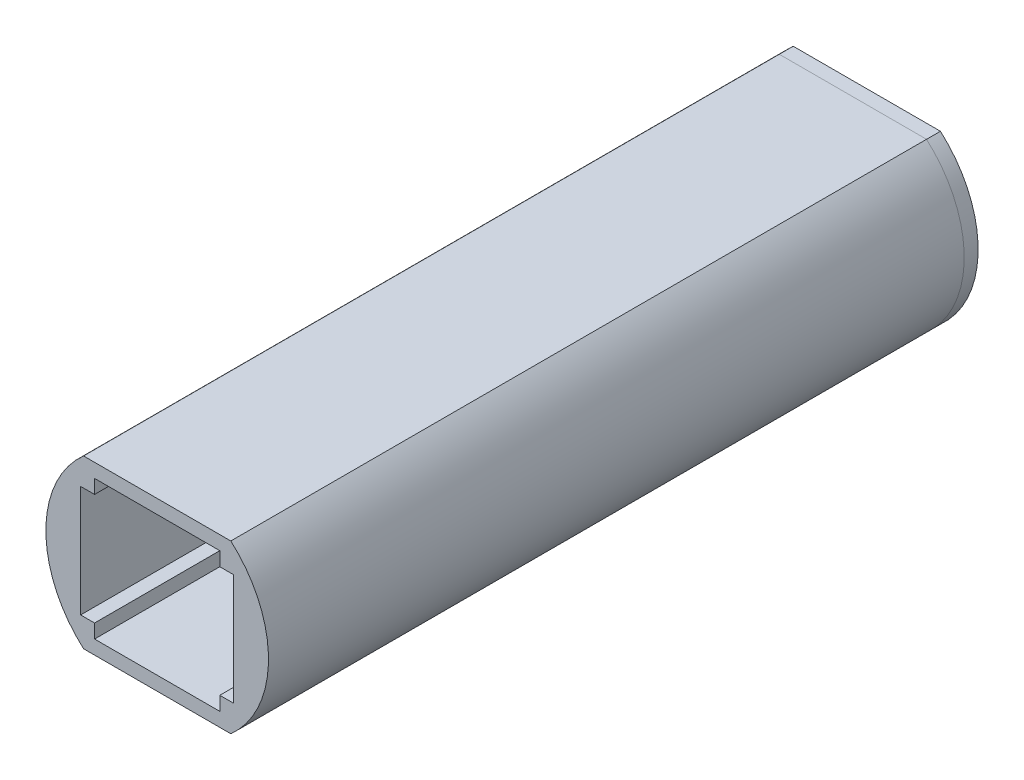
ISO-10303-21;
HEADER;
FILE_DESCRIPTION(('STEP AP214'),'2;1');
FILE_NAME('part.step','',(''),(''),'','','');
FILE_SCHEMA(('AUTOMOTIVE_DESIGN { 1 0 10303 214 1 1 1 1 }'));
ENDSEC;
DATA;
#1=APPLICATION_CONTEXT('core data for automotive mechanical design processes');
#2=APPLICATION_PROTOCOL_DEFINITION('international standard','automotive_design',2000,#1);
#3=PRODUCT_CONTEXT('',#1,'mechanical');
#4=PRODUCT('Part','Part','',(#3));
#5=PRODUCT_RELATED_PRODUCT_CATEGORY('part','',(#4));
#6=PRODUCT_DEFINITION_FORMATION('','',#4);
#7=PRODUCT_DEFINITION_CONTEXT('part definition',#1,'design');
#8=PRODUCT_DEFINITION('design','',#6,#7);
#9=PRODUCT_DEFINITION_SHAPE('','',#8);
#10=(LENGTH_UNIT() NAMED_UNIT(*) SI_UNIT(.MILLI.,.METRE.));
#11=(NAMED_UNIT(*) PLANE_ANGLE_UNIT() SI_UNIT($,.RADIAN.));
#12=(NAMED_UNIT(*) SI_UNIT($,.STERADIAN.) SOLID_ANGLE_UNIT());
#13=UNCERTAINTY_MEASURE_WITH_UNIT(LENGTH_MEASURE(1.E-05),#10,'distance_accuracy_value','');
#14=(GEOMETRIC_REPRESENTATION_CONTEXT(3) GLOBAL_UNCERTAINTY_ASSIGNED_CONTEXT((#13)) GLOBAL_UNIT_ASSIGNED_CONTEXT((#10,
#11,#12)) REPRESENTATION_CONTEXT('',''));
#15=CARTESIAN_POINT('',(0.,0.,0.));
#16=DIRECTION('',(0.,0.,1.));
#17=DIRECTION('',(1.,0.,0.));
#18=AXIS2_PLACEMENT_3D('',#15,#16,#17);
#19=CARTESIAN_POINT('',(0.,0.,51.));
#20=DIRECTION('',(0.,0.,-1.));
#21=DIRECTION('',(-1.,0.,0.));
#22=AXIS2_PLACEMENT_3D('',#19,#20,#21);
#23=CYLINDRICAL_SURFACE('',#22,8.);
#24=CARTESIAN_POINT('',(0.,0.,1.));
#25=DIRECTION('',(0.,0.,1.));
#26=DIRECTION('',(1.,0.,0.));
#27=AXIS2_PLACEMENT_3D('',#24,#25,#26);
#28=CIRCLE('',#27,8.);
#29=CARTESIAN_POINT('',(-5.29150262212918,6.,1.));
#30=VERTEX_POINT('',#29);
#31=CARTESIAN_POINT('',(-5.29150262212918,-6.,1.));
#32=VERTEX_POINT('',#31);
#33=EDGE_CURVE('E179',#30,#32,#28,.T.);
#34=ORIENTED_EDGE('',*,*,#33,.T.);
#35=DIRECTION('',(0.,0.,-1.));
#36=VECTOR('',#35,1.);
#37=CARTESIAN_POINT('',(-5.29150262212918,-6.,51.));
#38=LINE('',#37,#36);
#39=CARTESIAN_POINT('',(-5.29150262212918,-6.,51.));
#40=VERTEX_POINT('',#39);
#41=EDGE_CURVE('E12',#40,#32,#38,.T.);
#42=ORIENTED_EDGE('',*,*,#41,.F.);
#43=CARTESIAN_POINT('',(0.,0.,51.));
#44=DIRECTION('',(0.,0.,1.));
#45=DIRECTION('',(1.,0.,0.));
#46=AXIS2_PLACEMENT_3D('',#43,#44,#45);
#47=CIRCLE('',#46,8.);
#48=CARTESIAN_POINT('',(-5.29150262212918,6.,51.));
#49=VERTEX_POINT('',#48);
#50=EDGE_CURVE('E244',#49,#40,#47,.T.);
#51=ORIENTED_EDGE('',*,*,#50,.F.);
#52=DIRECTION('',(0.,0.,-1.));
#53=VECTOR('',#52,1.);
#54=CARTESIAN_POINT('',(-5.29150262212918,6.,51.));
#55=LINE('',#54,#53);
#56=EDGE_CURVE('E254',#49,#30,#55,.T.);
#57=ORIENTED_EDGE('',*,*,#56,.T.);
#58=EDGE_LOOP('',(#34,#42,#51,#57));
#59=FACE_BOUND('',#58,.T.);
#60=ADVANCED_FACE('F53',(#59),#23,.T.);
#61=CARTESIAN_POINT('',(-5.29150262212918,-6.,51.));
#62=DIRECTION('',(0.,1.,0.));
#63=DIRECTION('',(0.,0.,1.));
#64=AXIS2_PLACEMENT_3D('',#61,#62,#63);
#65=PLANE('',#64);
#66=DIRECTION('',(1.,0.,0.));
#67=VECTOR('',#66,1.);
#68=CARTESIAN_POINT('',(-5.29150262212918,-6.,1.));
#69=LINE('',#68,#67);
#70=CARTESIAN_POINT('',(5.29150262212918,-6.,1.));
#71=VERTEX_POINT('',#70);
#72=EDGE_CURVE('E257',#32,#71,#69,.T.);
#73=ORIENTED_EDGE('',*,*,#72,.T.);
#74=DIRECTION('',(0.,0.,-1.));
#75=VECTOR('',#74,1.);
#76=CARTESIAN_POINT('',(5.29150262212918,-6.,51.));
#77=LINE('',#76,#75);
#78=CARTESIAN_POINT('',(5.29150262212918,-6.,51.));
#79=VERTEX_POINT('',#78);
#80=EDGE_CURVE('E60',#79,#71,#77,.T.);
#81=ORIENTED_EDGE('',*,*,#80,.F.);
#82=DIRECTION('',(1.,0.,0.));
#83=VECTOR('',#82,1.);
#84=CARTESIAN_POINT('',(-5.29150262212918,-6.,51.));
#85=LINE('',#84,#83);
#86=EDGE_CURVE('E247',#40,#79,#85,.T.);
#87=ORIENTED_EDGE('',*,*,#86,.F.);
#88=ORIENTED_EDGE('',*,*,#41,.T.);
#89=EDGE_LOOP('',(#73,#81,#87,#88));
#90=FACE_BOUND('',#89,.T.);
#91=ADVANCED_FACE('F285',(#90),#65,.F.);
#92=CARTESIAN_POINT('',(0.,0.,51.));
#93=DIRECTION('',(0.,0.,-1.));
#94=DIRECTION('',(-1.,0.,0.));
#95=AXIS2_PLACEMENT_3D('',#92,#93,#94);
#96=CYLINDRICAL_SURFACE('',#95,8.);
#97=CARTESIAN_POINT('',(0.,0.,1.));
#98=DIRECTION('',(0.,0.,1.));
#99=DIRECTION('',(1.,0.,0.));
#100=AXIS2_PLACEMENT_3D('',#97,#98,#99);
#101=CIRCLE('',#100,8.);
#102=CARTESIAN_POINT('',(5.29150262212918,6.,1.));
#103=VERTEX_POINT('',#102);
#104=EDGE_CURVE('E259',#71,#103,#101,.T.);
#105=ORIENTED_EDGE('',*,*,#104,.T.);
#106=DIRECTION('',(0.,0.,-1.));
#107=VECTOR('',#106,1.);
#108=CARTESIAN_POINT('',(5.29150262212918,6.,51.));
#109=LINE('',#108,#107);
#110=CARTESIAN_POINT('',(5.29150262212918,6.,51.));
#111=VERTEX_POINT('',#110);
#112=EDGE_CURVE('E264',#111,#103,#109,.T.);
#113=ORIENTED_EDGE('',*,*,#112,.F.);
#114=CARTESIAN_POINT('',(0.,0.,51.));
#115=DIRECTION('',(0.,0.,1.));
#116=DIRECTION('',(1.,0.,0.));
#117=AXIS2_PLACEMENT_3D('',#114,#115,#116);
#118=CIRCLE('',#117,8.);
#119=EDGE_CURVE('E250',#79,#111,#118,.T.);
#120=ORIENTED_EDGE('',*,*,#119,.F.);
#121=ORIENTED_EDGE('',*,*,#80,.T.);
#122=EDGE_LOOP('',(#105,#113,#120,#121));
#123=FACE_BOUND('',#122,.T.);
#124=ADVANCED_FACE('F271',(#123),#96,.T.);
#125=CARTESIAN_POINT('',(-5.29150262212918,6.,51.));
#126=DIRECTION('',(0.,-1.,0.));
#127=DIRECTION('',(0.,0.,-1.));
#128=AXIS2_PLACEMENT_3D('',#125,#126,#127);
#129=PLANE('',#128);
#130=DIRECTION('',(-1.,0.,0.));
#131=VECTOR('',#130,1.);
#132=CARTESIAN_POINT('',(-5.29150262212918,6.,1.));
#133=LINE('',#132,#131);
#134=EDGE_CURVE('E248',#103,#30,#133,.T.);
#135=ORIENTED_EDGE('',*,*,#134,.T.);
#136=ORIENTED_EDGE('',*,*,#56,.F.);
#137=DIRECTION('',(-1.,0.,0.));
#138=VECTOR('',#137,1.);
#139=CARTESIAN_POINT('',(-5.29150262212918,6.,51.));
#140=LINE('',#139,#138);
#141=EDGE_CURVE('E252',#111,#49,#140,.T.);
#142=ORIENTED_EDGE('',*,*,#141,.F.);
#143=ORIENTED_EDGE('',*,*,#112,.T.);
#144=EDGE_LOOP('',(#135,#136,#142,#143));
#145=FACE_BOUND('',#144,.T.);
#146=ADVANCED_FACE('F278',(#145),#129,.F.);
#147=CARTESIAN_POINT('',(0.,0.,51.));
#148=DIRECTION('',(0.,0.,1.));
#149=DIRECTION('',(1.,0.,0.));
#150=AXIS2_PLACEMENT_3D('',#147,#148,#149);
#151=PLANE('',#150);
#152=DIRECTION('',(-1.,0.,0.));
#153=VECTOR('',#152,1.);
#154=CARTESIAN_POINT('',(4.5,5.,51.));
#155=LINE('',#154,#153);
#156=CARTESIAN_POINT('',(4.5,5.,51.));
#157=VERTEX_POINT('',#156);
#158=CARTESIAN_POINT('',(-4.5,5.,51.));
#159=VERTEX_POINT('',#158);
#160=EDGE_CURVE('E67',#157,#159,#155,.T.);
#161=ORIENTED_EDGE('',*,*,#160,.F.);
#162=DIRECTION('',(0.,1.,0.));
#163=VECTOR('',#162,1.);
#164=CARTESIAN_POINT('',(4.5,5.,51.));
#165=LINE('',#164,#163);
#166=CARTESIAN_POINT('',(4.5,4.,51.));
#167=VERTEX_POINT('',#166);
#168=EDGE_CURVE('E173',#167,#157,#165,.T.);
#169=ORIENTED_EDGE('',*,*,#168,.F.);
#170=DIRECTION('',(-1.,0.,0.));
#171=VECTOR('',#170,1.);
#172=CARTESIAN_POINT('',(4.5,4.,51.));
#173=LINE('',#172,#171);
#174=CARTESIAN_POINT('',(5.5,4.,51.));
#175=VERTEX_POINT('',#174);
#176=EDGE_CURVE('E219',#175,#167,#173,.T.);
#177=ORIENTED_EDGE('',*,*,#176,.F.);
#178=DIRECTION('',(0.,1.,0.));
#179=VECTOR('',#178,1.);
#180=CARTESIAN_POINT('',(5.5,-4.,51.));
#181=LINE('',#180,#179);
#182=CARTESIAN_POINT('',(5.5,-4.,51.));
#183=VERTEX_POINT('',#182);
#184=EDGE_CURVE('E216',#183,#175,#181,.T.);
#185=ORIENTED_EDGE('',*,*,#184,.F.);
#186=DIRECTION('',(1.,0.,0.));
#187=VECTOR('',#186,1.);
#188=CARTESIAN_POINT('',(4.5,-4.,51.));
#189=LINE('',#188,#187);
#190=CARTESIAN_POINT('',(4.5,-4.,51.));
#191=VERTEX_POINT('',#190);
#192=EDGE_CURVE('E213',#191,#183,#189,.T.);
#193=ORIENTED_EDGE('',*,*,#192,.F.);
#194=DIRECTION('',(0.,1.,0.));
#195=VECTOR('',#194,1.);
#196=CARTESIAN_POINT('',(4.5,-5.,51.));
#197=LINE('',#196,#195);
#198=CARTESIAN_POINT('',(4.5,-5.,51.));
#199=VERTEX_POINT('',#198);
#200=EDGE_CURVE('E210',#199,#191,#197,.T.);
#201=ORIENTED_EDGE('',*,*,#200,.F.);
#202=DIRECTION('',(1.,0.,0.));
#203=VECTOR('',#202,1.);
#204=CARTESIAN_POINT('',(4.5,-5.,51.));
#205=LINE('',#204,#203);
#206=CARTESIAN_POINT('',(-4.5,-5.,51.));
#207=VERTEX_POINT('',#206);
#208=EDGE_CURVE('E207',#207,#199,#205,.T.);
#209=ORIENTED_EDGE('',*,*,#208,.F.);
#210=DIRECTION('',(0.,-1.,0.));
#211=VECTOR('',#210,1.);
#212=CARTESIAN_POINT('',(-4.5,-5.,51.));
#213=LINE('',#212,#211);
#214=CARTESIAN_POINT('',(-4.5,-4.,51.));
#215=VERTEX_POINT('',#214);
#216=EDGE_CURVE('E204',#215,#207,#213,.T.);
#217=ORIENTED_EDGE('',*,*,#216,.F.);
#218=DIRECTION('',(1.,0.,0.));
#219=VECTOR('',#218,1.);
#220=CARTESIAN_POINT('',(-4.5,-4.,51.));
#221=LINE('',#220,#219);
#222=CARTESIAN_POINT('',(-5.5,-4.,51.));
#223=VERTEX_POINT('',#222);
#224=EDGE_CURVE('E201',#223,#215,#221,.T.);
#225=ORIENTED_EDGE('',*,*,#224,.F.);
#226=DIRECTION('',(0.,-1.,0.));
#227=VECTOR('',#226,1.);
#228=CARTESIAN_POINT('',(-5.5,-4.,51.));
#229=LINE('',#228,#227);
#230=CARTESIAN_POINT('',(-5.5,4.,51.));
#231=VERTEX_POINT('',#230);
#232=EDGE_CURVE('E198',#231,#223,#229,.T.);
#233=ORIENTED_EDGE('',*,*,#232,.F.);
#234=DIRECTION('',(-1.,0.,0.));
#235=VECTOR('',#234,1.);
#236=CARTESIAN_POINT('',(-4.5,4.,51.));
#237=LINE('',#236,#235);
#238=CARTESIAN_POINT('',(-4.5,4.,51.));
#239=VERTEX_POINT('',#238);
#240=EDGE_CURVE('E195',#239,#231,#237,.T.);
#241=ORIENTED_EDGE('',*,*,#240,.F.);
#242=DIRECTION('',(0.,-1.,0.));
#243=VECTOR('',#242,1.);
#244=CARTESIAN_POINT('',(-4.5,5.,51.));
#245=LINE('',#244,#243);
#246=EDGE_CURVE('E188',#159,#239,#245,.T.);
#247=ORIENTED_EDGE('',*,*,#246,.F.);
#248=EDGE_LOOP('',(#161,#169,#177,#185,#193,#201,#209,#217,#225,#233,#241,#247));
#249=FACE_BOUND('',#248,.T.);
#250=ORIENTED_EDGE('',*,*,#50,.T.);
#251=ORIENTED_EDGE('',*,*,#86,.T.);
#252=ORIENTED_EDGE('',*,*,#119,.T.);
#253=ORIENTED_EDGE('',*,*,#141,.T.);
#254=EDGE_LOOP('',(#250,#251,#252,#253));
#255=FACE_BOUND('',#254,.T.);
#256=ADVANCED_FACE('F284',(#249,#255),#151,.T.);
#257=CARTESIAN_POINT('',(0.,0.,1.));
#258=DIRECTION('',(0.,0.,1.));
#259=DIRECTION('',(1.,0.,0.));
#260=AXIS2_PLACEMENT_3D('',#257,#258,#259);
#261=PLANE('',#260);
#262=DIRECTION('',(0.,-1.,0.));
#263=VECTOR('',#262,1.);
#264=CARTESIAN_POINT('',(4.5,5.,1.));
#265=LINE('',#264,#263);
#266=CARTESIAN_POINT('',(4.5,5.,1.));
#267=VERTEX_POINT('',#266);
#268=CARTESIAN_POINT('',(4.5,4.,1.));
#269=VERTEX_POINT('',#268);
#270=EDGE_CURVE('E186',#267,#269,#265,.T.);
#271=ORIENTED_EDGE('',*,*,#270,.F.);
#272=DIRECTION('',(1.,0.,0.));
#273=VECTOR('',#272,1.);
#274=CARTESIAN_POINT('',(4.5,5.,1.));
#275=LINE('',#274,#273);
#276=CARTESIAN_POINT('',(-4.5,5.,1.));
#277=VERTEX_POINT('',#276);
#278=EDGE_CURVE('E167',#277,#267,#275,.T.);
#279=ORIENTED_EDGE('',*,*,#278,.F.);
#280=DIRECTION('',(0.,1.,0.));
#281=VECTOR('',#280,1.);
#282=CARTESIAN_POINT('',(-4.5,5.,1.));
#283=LINE('',#282,#281);
#284=CARTESIAN_POINT('',(-4.5,4.,1.));
#285=VERTEX_POINT('',#284);
#286=EDGE_CURVE('E176',#285,#277,#283,.T.);
#287=ORIENTED_EDGE('',*,*,#286,.F.);
#288=DIRECTION('',(1.,0.,0.));
#289=VECTOR('',#288,1.);
#290=CARTESIAN_POINT('',(-4.5,4.,1.));
#291=LINE('',#290,#289);
#292=CARTESIAN_POINT('',(-5.5,4.,1.));
#293=VERTEX_POINT('',#292);
#294=EDGE_CURVE('E75',#293,#285,#291,.T.);
#295=ORIENTED_EDGE('',*,*,#294,.F.);
#296=DIRECTION('',(0.,1.,0.));
#297=VECTOR('',#296,1.);
#298=CARTESIAN_POINT('',(-5.5,-4.,1.));
#299=LINE('',#298,#297);
#300=CARTESIAN_POINT('',(-5.5,-4.,1.));
#301=VERTEX_POINT('',#300);
#302=EDGE_CURVE('E366',#301,#293,#299,.T.);
#303=ORIENTED_EDGE('',*,*,#302,.F.);
#304=DIRECTION('',(-1.,0.,0.));
#305=VECTOR('',#304,1.);
#306=CARTESIAN_POINT('',(-4.5,-4.,1.));
#307=LINE('',#306,#305);
#308=CARTESIAN_POINT('',(-4.5,-4.,1.));
#309=VERTEX_POINT('',#308);
#310=EDGE_CURVE('E363',#309,#301,#307,.T.);
#311=ORIENTED_EDGE('',*,*,#310,.F.);
#312=DIRECTION('',(0.,1.,0.));
#313=VECTOR('',#312,1.);
#314=CARTESIAN_POINT('',(-4.5,-5.,1.));
#315=LINE('',#314,#313);
#316=CARTESIAN_POINT('',(-4.5,-5.,1.));
#317=VERTEX_POINT('',#316);
#318=EDGE_CURVE('E360',#317,#309,#315,.T.);
#319=ORIENTED_EDGE('',*,*,#318,.F.);
#320=DIRECTION('',(-1.,0.,0.));
#321=VECTOR('',#320,1.);
#322=CARTESIAN_POINT('',(4.5,-5.,1.));
#323=LINE('',#322,#321);
#324=CARTESIAN_POINT('',(4.5,-5.,1.));
#325=VERTEX_POINT('',#324);
#326=EDGE_CURVE('E357',#325,#317,#323,.T.);
#327=ORIENTED_EDGE('',*,*,#326,.F.);
#328=DIRECTION('',(0.,-1.,0.));
#329=VECTOR('',#328,1.);
#330=CARTESIAN_POINT('',(4.5,-5.,1.));
#331=LINE('',#330,#329);
#332=CARTESIAN_POINT('',(4.5,-4.,1.));
#333=VERTEX_POINT('',#332);
#334=EDGE_CURVE('E354',#333,#325,#331,.T.);
#335=ORIENTED_EDGE('',*,*,#334,.F.);
#336=DIRECTION('',(-1.,0.,0.));
#337=VECTOR('',#336,1.);
#338=CARTESIAN_POINT('',(4.5,-4.,1.));
#339=LINE('',#338,#337);
#340=CARTESIAN_POINT('',(5.5,-4.,1.));
#341=VERTEX_POINT('',#340);
#342=EDGE_CURVE('E349',#341,#333,#339,.T.);
#343=ORIENTED_EDGE('',*,*,#342,.F.);
#344=DIRECTION('',(0.,-1.,0.));
#345=VECTOR('',#344,1.);
#346=CARTESIAN_POINT('',(5.5,-4.,1.));
#347=LINE('',#346,#345);
#348=CARTESIAN_POINT('',(5.5,4.,1.));
#349=VERTEX_POINT('',#348);
#350=EDGE_CURVE('E348',#349,#341,#347,.T.);
#351=ORIENTED_EDGE('',*,*,#350,.F.);
#352=DIRECTION('',(1.,0.,0.));
#353=VECTOR('',#352,1.);
#354=CARTESIAN_POINT('',(4.5,4.,1.));
#355=LINE('',#354,#353);
#356=EDGE_CURVE('E190',#269,#349,#355,.T.);
#357=ORIENTED_EDGE('',*,*,#356,.F.);
#358=EDGE_LOOP('',(#271,#279,#287,#295,#303,#311,#319,#327,#335,#343,#351,#357));
#359=FACE_BOUND('',#358,.T.);
#360=ORIENTED_EDGE('',*,*,#33,.F.);
#361=ORIENTED_EDGE('',*,*,#134,.F.);
#362=ORIENTED_EDGE('',*,*,#104,.F.);
#363=ORIENTED_EDGE('',*,*,#72,.F.);
#364=EDGE_LOOP('',(#360,#361,#362,#363));
#365=FACE_BOUND('',#364,.T.);
#366=ADVANCED_FACE('F182',(#359,#365),#261,.F.);
#367=CARTESIAN_POINT('',(4.5,5.,-0.001000000000001));
#368=DIRECTION('',(0.,1.,0.));
#369=DIRECTION('',(0.,0.,1.));
#370=AXIS2_PLACEMENT_3D('',#367,#368,#369);
#371=PLANE('',#370);
#372=ORIENTED_EDGE('',*,*,#278,.T.);
#373=DIRECTION('',(0.,0.,1.));
#374=VECTOR('',#373,1.);
#375=CARTESIAN_POINT('',(4.5,5.,-0.001000000000001));
#376=LINE('',#375,#374);
#377=EDGE_CURVE('E180',#267,#157,#376,.T.);
#378=ORIENTED_EDGE('',*,*,#377,.T.);
#379=ORIENTED_EDGE('',*,*,#160,.T.);
#380=DIRECTION('',(0.,0.,1.));
#381=VECTOR('',#380,1.);
#382=CARTESIAN_POINT('',(-4.5,5.,-0.001000000000001));
#383=LINE('',#382,#381);
#384=EDGE_CURVE('E163',#277,#159,#383,.T.);
#385=ORIENTED_EDGE('',*,*,#384,.F.);
#386=EDGE_LOOP('',(#372,#378,#379,#385));
#387=FACE_BOUND('',#386,.T.);
#388=ADVANCED_FACE('F165',(#387),#371,.F.);
#389=CARTESIAN_POINT('',(4.5,5.,-0.001000000000001));
#390=DIRECTION('',(1.,0.,0.));
#391=DIRECTION('',(0.,0.,-1.));
#392=AXIS2_PLACEMENT_3D('',#389,#390,#391);
#393=PLANE('',#392);
#394=ORIENTED_EDGE('',*,*,#270,.T.);
#395=DIRECTION('',(0.,0.,1.));
#396=VECTOR('',#395,1.);
#397=CARTESIAN_POINT('',(4.5,4.,-0.001000000000001));
#398=LINE('',#397,#396);
#399=EDGE_CURVE('E225',#269,#167,#398,.T.);
#400=ORIENTED_EDGE('',*,*,#399,.T.);
#401=ORIENTED_EDGE('',*,*,#168,.T.);
#402=ORIENTED_EDGE('',*,*,#377,.F.);
#403=EDGE_LOOP('',(#394,#400,#401,#402));
#404=FACE_BOUND('',#403,.T.);
#405=ADVANCED_FACE('F302',(#404),#393,.F.);
#406=CARTESIAN_POINT('',(4.5,4.,-0.001000000000001));
#407=DIRECTION('',(0.,1.,0.));
#408=DIRECTION('',(0.,0.,1.));
#409=AXIS2_PLACEMENT_3D('',#406,#407,#408);
#410=PLANE('',#409);
#411=ORIENTED_EDGE('',*,*,#356,.T.);
#412=DIRECTION('',(0.,0.,1.));
#413=VECTOR('',#412,1.);
#414=CARTESIAN_POINT('',(5.5,4.,-0.001000000000001));
#415=LINE('',#414,#413);
#416=EDGE_CURVE('E227',#349,#175,#415,.T.);
#417=ORIENTED_EDGE('',*,*,#416,.T.);
#418=ORIENTED_EDGE('',*,*,#176,.T.);
#419=ORIENTED_EDGE('',*,*,#399,.F.);
#420=EDGE_LOOP('',(#411,#417,#418,#419));
#421=FACE_BOUND('',#420,.T.);
#422=ADVANCED_FACE('F335',(#421),#410,.F.);
#423=CARTESIAN_POINT('',(5.5,-4.,-0.001000000000001));
#424=DIRECTION('',(1.,0.,0.));
#425=DIRECTION('',(0.,0.,-1.));
#426=AXIS2_PLACEMENT_3D('',#423,#424,#425);
#427=PLANE('',#426);
#428=ORIENTED_EDGE('',*,*,#350,.T.);
#429=DIRECTION('',(0.,0.,1.));
#430=VECTOR('',#429,1.);
#431=CARTESIAN_POINT('',(5.5,-4.,-0.001000000000001));
#432=LINE('',#431,#430);
#433=EDGE_CURVE('E229',#341,#183,#432,.T.);
#434=ORIENTED_EDGE('',*,*,#433,.T.);
#435=ORIENTED_EDGE('',*,*,#184,.T.);
#436=ORIENTED_EDGE('',*,*,#416,.F.);
#437=EDGE_LOOP('',(#428,#434,#435,#436));
#438=FACE_BOUND('',#437,.T.);
#439=ADVANCED_FACE('F331',(#438),#427,.F.);
#440=CARTESIAN_POINT('',(4.5,-4.,-0.001000000000001));
#441=DIRECTION('',(0.,-1.,0.));
#442=DIRECTION('',(0.,0.,-1.));
#443=AXIS2_PLACEMENT_3D('',#440,#441,#442);
#444=PLANE('',#443);
#445=ORIENTED_EDGE('',*,*,#342,.T.);
#446=DIRECTION('',(0.,0.,1.));
#447=VECTOR('',#446,1.);
#448=CARTESIAN_POINT('',(4.5,-4.,-0.001000000000001));
#449=LINE('',#448,#447);
#450=EDGE_CURVE('E231',#333,#191,#449,.T.);
#451=ORIENTED_EDGE('',*,*,#450,.T.);
#452=ORIENTED_EDGE('',*,*,#192,.T.);
#453=ORIENTED_EDGE('',*,*,#433,.F.);
#454=EDGE_LOOP('',(#445,#451,#452,#453));
#455=FACE_BOUND('',#454,.T.);
#456=ADVANCED_FACE('F327',(#455),#444,.F.);
#457=CARTESIAN_POINT('',(4.5,-5.,-0.001000000000001));
#458=DIRECTION('',(1.,0.,0.));
#459=DIRECTION('',(0.,0.,-1.));
#460=AXIS2_PLACEMENT_3D('',#457,#458,#459);
#461=PLANE('',#460);
#462=ORIENTED_EDGE('',*,*,#334,.T.);
#463=DIRECTION('',(0.,0.,1.));
#464=VECTOR('',#463,1.);
#465=CARTESIAN_POINT('',(4.5,-5.,-0.001000000000001));
#466=LINE('',#465,#464);
#467=EDGE_CURVE('E233',#325,#199,#466,.T.);
#468=ORIENTED_EDGE('',*,*,#467,.T.);
#469=ORIENTED_EDGE('',*,*,#200,.T.);
#470=ORIENTED_EDGE('',*,*,#450,.F.);
#471=EDGE_LOOP('',(#462,#468,#469,#470));
#472=FACE_BOUND('',#471,.T.);
#473=ADVANCED_FACE('F323',(#472),#461,.F.);
#474=CARTESIAN_POINT('',(4.5,-5.,-0.001000000000001));
#475=DIRECTION('',(0.,-1.,0.));
#476=DIRECTION('',(0.,0.,-1.));
#477=AXIS2_PLACEMENT_3D('',#474,#475,#476);
#478=PLANE('',#477);
#479=ORIENTED_EDGE('',*,*,#326,.T.);
#480=DIRECTION('',(0.,0.,1.));
#481=VECTOR('',#480,1.);
#482=CARTESIAN_POINT('',(-4.5,-5.,-0.001000000000001));
#483=LINE('',#482,#481);
#484=EDGE_CURVE('E235',#317,#207,#483,.T.);
#485=ORIENTED_EDGE('',*,*,#484,.T.);
#486=ORIENTED_EDGE('',*,*,#208,.T.);
#487=ORIENTED_EDGE('',*,*,#467,.F.);
#488=EDGE_LOOP('',(#479,#485,#486,#487));
#489=FACE_BOUND('',#488,.T.);
#490=ADVANCED_FACE('F319',(#489),#478,.F.);
#491=CARTESIAN_POINT('',(-4.5,-5.,-0.001000000000001));
#492=DIRECTION('',(-1.,0.,0.));
#493=DIRECTION('',(0.,0.,1.));
#494=AXIS2_PLACEMENT_3D('',#491,#492,#493);
#495=PLANE('',#494);
#496=ORIENTED_EDGE('',*,*,#318,.T.);
#497=DIRECTION('',(0.,0.,1.));
#498=VECTOR('',#497,1.);
#499=CARTESIAN_POINT('',(-4.5,-4.,-0.001000000000001));
#500=LINE('',#499,#498);
#501=EDGE_CURVE('E237',#309,#215,#500,.T.);
#502=ORIENTED_EDGE('',*,*,#501,.T.);
#503=ORIENTED_EDGE('',*,*,#216,.T.);
#504=ORIENTED_EDGE('',*,*,#484,.F.);
#505=EDGE_LOOP('',(#496,#502,#503,#504));
#506=FACE_BOUND('',#505,.T.);
#507=ADVANCED_FACE('F315',(#506),#495,.F.);
#508=CARTESIAN_POINT('',(-4.5,-4.,-0.001000000000001));
#509=DIRECTION('',(0.,-1.,0.));
#510=DIRECTION('',(0.,0.,-1.));
#511=AXIS2_PLACEMENT_3D('',#508,#509,#510);
#512=PLANE('',#511);
#513=ORIENTED_EDGE('',*,*,#310,.T.);
#514=DIRECTION('',(0.,0.,1.));
#515=VECTOR('',#514,1.);
#516=CARTESIAN_POINT('',(-5.5,-4.,-0.001000000000001));
#517=LINE('',#516,#515);
#518=EDGE_CURVE('E239',#301,#223,#517,.T.);
#519=ORIENTED_EDGE('',*,*,#518,.T.);
#520=ORIENTED_EDGE('',*,*,#224,.T.);
#521=ORIENTED_EDGE('',*,*,#501,.F.);
#522=EDGE_LOOP('',(#513,#519,#520,#521));
#523=FACE_BOUND('',#522,.T.);
#524=ADVANCED_FACE('F311',(#523),#512,.F.);
#525=CARTESIAN_POINT('',(-5.5,-4.,-0.001000000000001));
#526=DIRECTION('',(-1.,0.,0.));
#527=DIRECTION('',(0.,0.,1.));
#528=AXIS2_PLACEMENT_3D('',#525,#526,#527);
#529=PLANE('',#528);
#530=ORIENTED_EDGE('',*,*,#302,.T.);
#531=DIRECTION('',(0.,0.,1.));
#532=VECTOR('',#531,1.);
#533=CARTESIAN_POINT('',(-5.5,4.,-0.001000000000001));
#534=LINE('',#533,#532);
#535=EDGE_CURVE('E241',#293,#231,#534,.T.);
#536=ORIENTED_EDGE('',*,*,#535,.T.);
#537=ORIENTED_EDGE('',*,*,#232,.T.);
#538=ORIENTED_EDGE('',*,*,#518,.F.);
#539=EDGE_LOOP('',(#530,#536,#537,#538));
#540=FACE_BOUND('',#539,.T.);
#541=ADVANCED_FACE('F308',(#540),#529,.F.);
#542=CARTESIAN_POINT('',(-4.5,4.,-0.001000000000001));
#543=DIRECTION('',(0.,1.,0.));
#544=DIRECTION('',(0.,0.,1.));
#545=AXIS2_PLACEMENT_3D('',#542,#543,#544);
#546=PLANE('',#545);
#547=ORIENTED_EDGE('',*,*,#294,.T.);
#548=DIRECTION('',(0.,0.,1.));
#549=VECTOR('',#548,1.);
#550=CARTESIAN_POINT('',(-4.5,4.,-0.001000000000001));
#551=LINE('',#550,#549);
#552=EDGE_CURVE('E172',#285,#239,#551,.T.);
#553=ORIENTED_EDGE('',*,*,#552,.T.);
#554=ORIENTED_EDGE('',*,*,#240,.T.);
#555=ORIENTED_EDGE('',*,*,#535,.F.);
#556=EDGE_LOOP('',(#547,#553,#554,#555));
#557=FACE_BOUND('',#556,.T.);
#558=ADVANCED_FACE('F305',(#557),#546,.F.);
#559=CARTESIAN_POINT('',(-4.5,5.,-0.001000000000001));
#560=DIRECTION('',(-1.,0.,0.));
#561=DIRECTION('',(0.,0.,1.));
#562=AXIS2_PLACEMENT_3D('',#559,#560,#561);
#563=PLANE('',#562);
#564=ORIENTED_EDGE('',*,*,#286,.T.);
#565=ORIENTED_EDGE('',*,*,#384,.T.);
#566=ORIENTED_EDGE('',*,*,#246,.T.);
#567=ORIENTED_EDGE('',*,*,#552,.F.);
#568=EDGE_LOOP('',(#564,#565,#566,#567));
#569=FACE_BOUND('',#568,.T.);
#570=ADVANCED_FACE('F177',(#569),#563,.F.);
#571=CLOSED_SHELL('',(#60,#91,#124,#146,#256,#366,#388,#405,#422,#439,#456,#473,#490,#507,#524,
#541,#558,#570));
#572=MANIFOLD_SOLID_BREP('B2',#571);
#573=CARTESIAN_POINT('',(0.,0.,1.));
#574=DIRECTION('',(0.,0.,-1.));
#575=DIRECTION('',(-1.,0.,0.));
#576=AXIS2_PLACEMENT_3D('',#573,#574,#575);
#577=CYLINDRICAL_SURFACE('',#576,8.);
#578=CARTESIAN_POINT('',(0.,0.,0.));
#579=DIRECTION('',(0.,0.,1.));
#580=DIRECTION('',(1.,0.,0.));
#581=AXIS2_PLACEMENT_3D('',#578,#579,#580);
#582=CIRCLE('',#581,8.);
#583=CARTESIAN_POINT('',(-5.29150262212918,6.,0.));
#584=VERTEX_POINT('',#583);
#585=CARTESIAN_POINT('',(-5.29150262212918,-6.,0.));
#586=VERTEX_POINT('',#585);
#587=EDGE_CURVE('E554',#584,#586,#582,.T.);
#588=ORIENTED_EDGE('',*,*,#587,.T.);
#589=DIRECTION('',(0.,0.,-1.));
#590=VECTOR('',#589,1.);
#591=CARTESIAN_POINT('',(-5.29150262212918,-6.,1.));
#592=LINE('',#591,#590);
#593=CARTESIAN_POINT('',(-5.29150262212918,-6.,1.));
#594=VERTEX_POINT('',#593);
#595=EDGE_CURVE('E51',#594,#586,#592,.T.);
#596=ORIENTED_EDGE('',*,*,#595,.F.);
#597=CARTESIAN_POINT('',(0.,0.,1.));
#598=DIRECTION('',(0.,0.,1.));
#599=DIRECTION('',(1.,0.,0.));
#600=AXIS2_PLACEMENT_3D('',#597,#598,#599);
#601=CIRCLE('',#600,8.);
#602=CARTESIAN_POINT('',(-5.29150262212918,6.,1.));
#603=VERTEX_POINT('',#602);
#604=EDGE_CURVE('E542',#603,#594,#601,.T.);
#605=ORIENTED_EDGE('',*,*,#604,.F.);
#606=DIRECTION('',(0.,0.,-1.));
#607=VECTOR('',#606,1.);
#608=CARTESIAN_POINT('',(-5.29150262212918,6.,1.));
#609=LINE('',#608,#607);
#610=EDGE_CURVE('E550',#603,#584,#609,.T.);
#611=ORIENTED_EDGE('',*,*,#610,.T.);
#612=EDGE_LOOP('',(#588,#596,#605,#611));
#613=FACE_BOUND('',#612,.T.);
#614=ADVANCED_FACE('F491',(#613),#577,.T.);
#615=CARTESIAN_POINT('',(-5.29150262212918,-6.,1.));
#616=DIRECTION('',(0.,1.,0.));
#617=DIRECTION('',(0.,0.,1.));
#618=AXIS2_PLACEMENT_3D('',#615,#616,#617);
#619=PLANE('',#618);
#620=DIRECTION('',(1.,0.,0.));
#621=VECTOR('',#620,1.);
#622=CARTESIAN_POINT('',(-5.29150262212918,-6.,0.));
#623=LINE('',#622,#621);
#624=CARTESIAN_POINT('',(5.29150262212918,-6.,0.));
#625=VERTEX_POINT('',#624);
#626=EDGE_CURVE('E546',#586,#625,#623,.T.);
#627=ORIENTED_EDGE('',*,*,#626,.T.);
#628=DIRECTION('',(0.,0.,-1.));
#629=VECTOR('',#628,1.);
#630=CARTESIAN_POINT('',(5.29150262212918,-6.,1.));
#631=LINE('',#630,#629);
#632=CARTESIAN_POINT('',(5.29150262212918,-6.,1.));
#633=VERTEX_POINT('',#632);
#634=EDGE_CURVE('E499',#633,#625,#631,.T.);
#635=ORIENTED_EDGE('',*,*,#634,.F.);
#636=DIRECTION('',(1.,0.,0.));
#637=VECTOR('',#636,1.);
#638=CARTESIAN_POINT('',(-5.29150262212918,-6.,1.));
#639=LINE('',#638,#637);
#640=EDGE_CURVE('E537',#594,#633,#639,.T.);
#641=ORIENTED_EDGE('',*,*,#640,.F.);
#642=ORIENTED_EDGE('',*,*,#595,.T.);
#643=EDGE_LOOP('',(#627,#635,#641,#642));
#644=FACE_BOUND('',#643,.T.);
#645=ADVANCED_FACE('F545',(#644),#619,.F.);
#646=CARTESIAN_POINT('',(0.,0.,1.));
#647=DIRECTION('',(0.,0.,-1.));
#648=DIRECTION('',(-1.,0.,0.));
#649=AXIS2_PLACEMENT_3D('',#646,#647,#648);
#650=CYLINDRICAL_SURFACE('',#649,8.);
#651=CARTESIAN_POINT('',(0.,0.,0.));
#652=DIRECTION('',(0.,0.,1.));
#653=DIRECTION('',(1.,0.,0.));
#654=AXIS2_PLACEMENT_3D('',#651,#652,#653);
#655=CIRCLE('',#654,8.);
#656=CARTESIAN_POINT('',(5.29150262212918,6.,0.));
#657=VERTEX_POINT('',#656);
#658=EDGE_CURVE('E524',#625,#657,#655,.T.);
#659=ORIENTED_EDGE('',*,*,#658,.T.);
#660=DIRECTION('',(0.,0.,-1.));
#661=VECTOR('',#660,1.);
#662=CARTESIAN_POINT('',(5.29150262212918,6.,1.));
#663=LINE('',#662,#661);
#664=CARTESIAN_POINT('',(5.29150262212918,6.,1.));
#665=VERTEX_POINT('',#664);
#666=EDGE_CURVE('E547',#665,#657,#663,.T.);
#667=ORIENTED_EDGE('',*,*,#666,.F.);
#668=CARTESIAN_POINT('',(0.,0.,1.));
#669=DIRECTION('',(0.,0.,1.));
#670=DIRECTION('',(1.,0.,0.));
#671=AXIS2_PLACEMENT_3D('',#668,#669,#670);
#672=CIRCLE('',#671,8.);
#673=EDGE_CURVE('E540',#633,#665,#672,.T.);
#674=ORIENTED_EDGE('',*,*,#673,.F.);
#675=ORIENTED_EDGE('',*,*,#634,.T.);
#676=EDGE_LOOP('',(#659,#667,#674,#675));
#677=FACE_BOUND('',#676,.T.);
#678=ADVANCED_FACE('F548',(#677),#650,.T.);
#679=CARTESIAN_POINT('',(-5.29150262212918,6.,1.));
#680=DIRECTION('',(0.,-1.,0.));
#681=DIRECTION('',(0.,0.,-1.));
#682=AXIS2_PLACEMENT_3D('',#679,#680,#681);
#683=PLANE('',#682);
#684=DIRECTION('',(-1.,0.,0.));
#685=VECTOR('',#684,1.);
#686=CARTESIAN_POINT('',(-5.29150262212918,6.,0.));
#687=LINE('',#686,#685);
#688=EDGE_CURVE('E530',#657,#584,#687,.T.);
#689=ORIENTED_EDGE('',*,*,#688,.T.);
#690=ORIENTED_EDGE('',*,*,#610,.F.);
#691=DIRECTION('',(-1.,0.,0.));
#692=VECTOR('',#691,1.);
#693=CARTESIAN_POINT('',(-5.29150262212918,6.,1.));
#694=LINE('',#693,#692);
#695=EDGE_CURVE('E507',#665,#603,#694,.T.);
#696=ORIENTED_EDGE('',*,*,#695,.F.);
#697=ORIENTED_EDGE('',*,*,#666,.T.);
#698=EDGE_LOOP('',(#689,#690,#696,#697));
#699=FACE_BOUND('',#698,.T.);
#700=ADVANCED_FACE('F562',(#699),#683,.F.);
#701=CARTESIAN_POINT('',(0.,0.,1.));
#702=DIRECTION('',(0.,0.,1.));
#703=DIRECTION('',(1.,0.,0.));
#704=AXIS2_PLACEMENT_3D('',#701,#702,#703);
#705=PLANE('',#704);
#706=CARTESIAN_POINT('',(0.,0.,1.));
#707=DIRECTION('',(0.,0.,1.));
#708=DIRECTION('',(1.,0.,0.));
#709=AXIS2_PLACEMENT_3D('',#706,#707,#708);
#710=CIRCLE('',#709,4.5);
#711=CARTESIAN_POINT('',(4.5,0.,1.));
#712=VERTEX_POINT('',#711);
#713=EDGE_CURVE('E568',#712,#712,#710,.F.);
#714=ORIENTED_EDGE('',*,*,#713,.T.);
#715=EDGE_LOOP('',(#714));
#716=FACE_BOUND('',#715,.T.);
#717=ORIENTED_EDGE('',*,*,#604,.T.);
#718=ORIENTED_EDGE('',*,*,#640,.T.);
#719=ORIENTED_EDGE('',*,*,#673,.T.);
#720=ORIENTED_EDGE('',*,*,#695,.T.);
#721=EDGE_LOOP('',(#717,#718,#719,#720));
#722=FACE_BOUND('',#721,.T.);
#723=ADVANCED_FACE('F538',(#716,#722),#705,.T.);
#724=CARTESIAN_POINT('',(0.,0.,0.));
#725=DIRECTION('',(0.,0.,1.));
#726=DIRECTION('',(1.,0.,0.));
#727=AXIS2_PLACEMENT_3D('',#724,#725,#726);
#728=PLANE('',#727);
#729=CARTESIAN_POINT('',(0.,0.,0.));
#730=DIRECTION('',(0.,0.,-1.));
#731=DIRECTION('',(-1.,0.,0.));
#732=AXIS2_PLACEMENT_3D('',#729,#730,#731);
#733=CIRCLE('',#732,4.5);
#734=CARTESIAN_POINT('',(-4.5,0.,0.));
#735=VERTEX_POINT('',#734);
#736=EDGE_CURVE('E557',#735,#735,#733,.T.);
#737=ORIENTED_EDGE('',*,*,#736,.F.);
#738=EDGE_LOOP('',(#737));
#739=FACE_BOUND('',#738,.T.);
#740=ORIENTED_EDGE('',*,*,#587,.F.);
#741=ORIENTED_EDGE('',*,*,#688,.F.);
#742=ORIENTED_EDGE('',*,*,#658,.F.);
#743=ORIENTED_EDGE('',*,*,#626,.F.);
#744=EDGE_LOOP('',(#740,#741,#742,#743));
#745=FACE_BOUND('',#744,.T.);
#746=ADVANCED_FACE('F565',(#739,#745),#728,.F.);
#747=CARTESIAN_POINT('',(0.,0.,51.001));
#748=DIRECTION('',(0.,0.,-1.));
#749=DIRECTION('',(-1.,0.,0.));
#750=AXIS2_PLACEMENT_3D('',#747,#748,#749);
#751=CYLINDRICAL_SURFACE('',#750,4.5);
#752=ORIENTED_EDGE('',*,*,#713,.F.);
#753=EDGE_LOOP('',(#752));
#754=FACE_BOUND('',#753,.T.);
#755=ORIENTED_EDGE('',*,*,#736,.T.);
#756=EDGE_LOOP('',(#755));
#757=FACE_BOUND('',#756,.T.);
#758=ADVANCED_FACE('F574',(#754,#757),#751,.F.);
#759=CLOSED_SHELL('',(#614,#645,#678,#700,#723,#746,#758));
#760=MANIFOLD_SOLID_BREP('B6',#759);
#761=ADVANCED_BREP_SHAPE_REPRESENTATION('',(#18,#572,#760),#14);
#762=SHAPE_DEFINITION_REPRESENTATION(#9,#761);
ENDSEC;
END-ISO-10303-21;
